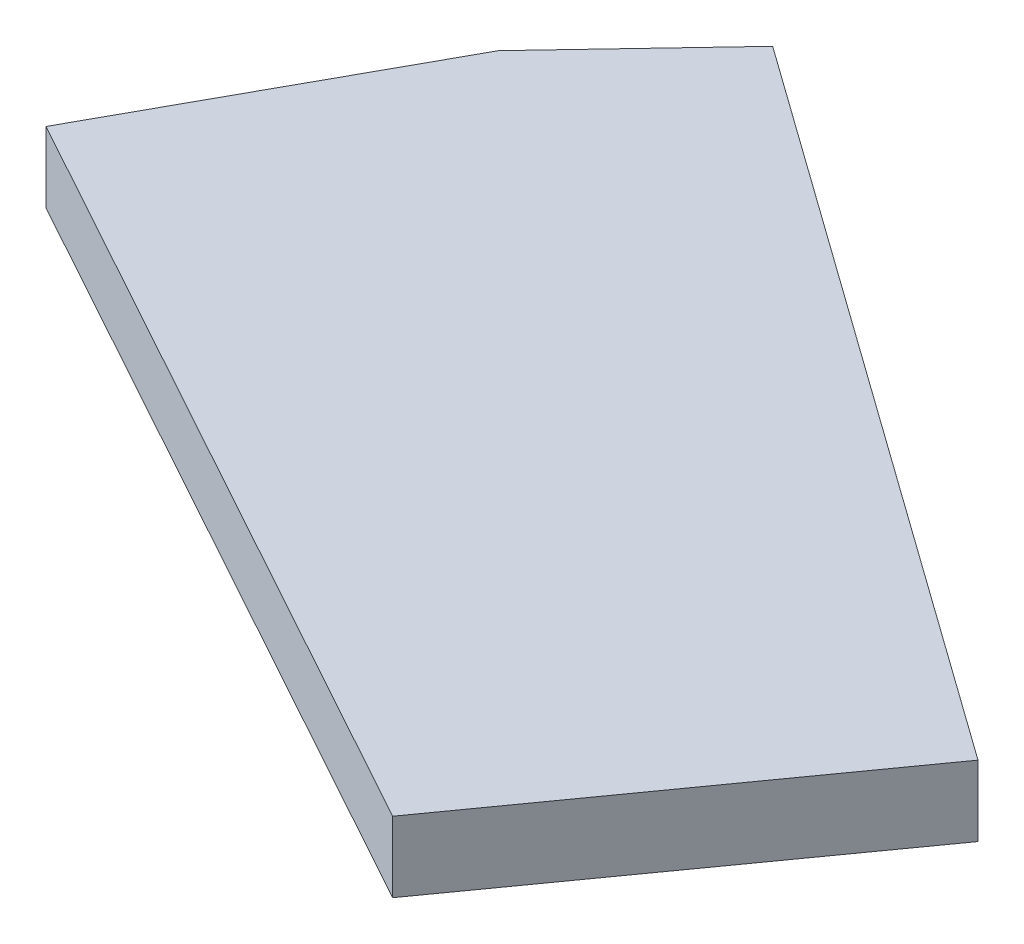
ISO-10303-21;
HEADER;
FILE_DESCRIPTION(('STEP AP214'),'2;1');
FILE_NAME('part.step','',(''),(''),'','','');
FILE_SCHEMA(('AUTOMOTIVE_DESIGN { 1 0 10303 214 1 1 1 1 }'));
ENDSEC;
DATA;
#1=APPLICATION_CONTEXT('core data for automotive mechanical design processes');
#2=APPLICATION_PROTOCOL_DEFINITION('international standard','automotive_design',2000,#1);
#3=PRODUCT_CONTEXT('',#1,'mechanical');
#4=PRODUCT('Part','Part','',(#3));
#5=PRODUCT_RELATED_PRODUCT_CATEGORY('part','',(#4));
#6=PRODUCT_DEFINITION_FORMATION('','',#4);
#7=PRODUCT_DEFINITION_CONTEXT('part definition',#1,'design');
#8=PRODUCT_DEFINITION('design','',#6,#7);
#9=PRODUCT_DEFINITION_SHAPE('','',#8);
#10=(LENGTH_UNIT() NAMED_UNIT(*) SI_UNIT(.MILLI.,.METRE.));
#11=(NAMED_UNIT(*) PLANE_ANGLE_UNIT() SI_UNIT($,.RADIAN.));
#12=(NAMED_UNIT(*) SI_UNIT($,.STERADIAN.) SOLID_ANGLE_UNIT());
#13=UNCERTAINTY_MEASURE_WITH_UNIT(LENGTH_MEASURE(1.E-05),#10,'distance_accuracy_value','');
#14=(GEOMETRIC_REPRESENTATION_CONTEXT(3) GLOBAL_UNCERTAINTY_ASSIGNED_CONTEXT((#13)) GLOBAL_UNIT_ASSIGNED_CONTEXT((#10,
#11,#12)) REPRESENTATION_CONTEXT('',''));
#15=CARTESIAN_POINT('',(0.,0.,0.));
#16=DIRECTION('',(0.,0.,1.));
#17=DIRECTION('',(1.,0.,0.));
#18=AXIS2_PLACEMENT_3D('',#15,#16,#17);
#19=CARTESIAN_POINT('',(-10.6043370878193,7.,-7.95325281586443));
#20=DIRECTION('',(0.,-1.,0.));
#21=DIRECTION('',(0.,0.,-1.));
#22=AXIS2_PLACEMENT_3D('',#19,#20,#21);
#23=CYLINDRICAL_SURFACE('',#22,2.5);
#24=CARTESIAN_POINT('',(-10.6043370878193,7.,-7.95325281586443));
#25=DIRECTION('',(0.,1.,0.));
#26=DIRECTION('',(0.,0.,1.));
#27=AXIS2_PLACEMENT_3D('',#24,#25,#26);
#28=CIRCLE('',#27,2.5);
#29=CARTESIAN_POINT('',(-10.6043370878193,7.,-5.45325281586443));
#30=VERTEX_POINT('',#29);
#31=EDGE_CURVE('E235',#30,#30,#28,.T.);
#32=ORIENTED_EDGE('',*,*,#31,.F.);
#33=EDGE_LOOP('',(#32));
#34=FACE_BOUND('',#33,.T.);
#35=CARTESIAN_POINT('',(-10.6043370878193,4.,-7.95325281586443));
#36=DIRECTION('',(0.,-1.,0.));
#37=DIRECTION('',(0.,0.,-1.));
#38=AXIS2_PLACEMENT_3D('',#35,#36,#37);
#39=CIRCLE('',#38,2.5);
#40=CARTESIAN_POINT('',(-10.6043370878193,4.,-10.4532528158644));
#41=VERTEX_POINT('',#40);
#42=EDGE_CURVE('E452',#41,#41,#39,.T.);
#43=ORIENTED_EDGE('',*,*,#42,.F.);
#44=EDGE_LOOP('',(#43));
#45=FACE_BOUND('',#44,.T.);
#46=ADVANCED_FACE('F49',(#34,#45),#23,.T.);
#47=CARTESIAN_POINT('',(16.0000000000001,7.,12.));
#48=DIRECTION('',(0.,-1.,0.));
#49=DIRECTION('',(0.,0.,-1.));
#50=AXIS2_PLACEMENT_3D('',#47,#48,#49);
#51=CYLINDRICAL_SURFACE('',#50,2.5);
#52=CARTESIAN_POINT('',(16.0000000000001,7.,12.));
#53=DIRECTION('',(0.,1.,0.));
#54=DIRECTION('',(0.,0.,1.));
#55=AXIS2_PLACEMENT_3D('',#52,#53,#54);
#56=CIRCLE('',#55,2.5);
#57=CARTESIAN_POINT('',(16.0000000000001,7.,14.5));
#58=VERTEX_POINT('',#57);
#59=EDGE_CURVE('E312',#58,#58,#56,.T.);
#60=ORIENTED_EDGE('',*,*,#59,.F.);
#61=EDGE_LOOP('',(#60));
#62=FACE_BOUND('',#61,.T.);
#63=CARTESIAN_POINT('',(16.0000000000001,4.,12.));
#64=DIRECTION('',(0.,-1.,0.));
#65=DIRECTION('',(0.,0.,-1.));
#66=AXIS2_PLACEMENT_3D('',#63,#64,#65);
#67=CIRCLE('',#66,2.5);
#68=CARTESIAN_POINT('',(16.0000000000001,4.,9.5));
#69=VERTEX_POINT('',#68);
#70=EDGE_CURVE('E458',#69,#69,#67,.T.);
#71=ORIENTED_EDGE('',*,*,#70,.F.);
#72=EDGE_LOOP('',(#71));
#73=FACE_BOUND('',#72,.T.);
#74=ADVANCED_FACE('F506',(#62,#73),#51,.T.);
#75=CARTESIAN_POINT('',(46.472222222222,7.,-89.1099464803364));
#76=DIRECTION('',(0.,1.,0.));
#77=DIRECTION('',(0.,0.,1.));
#78=AXIS2_PLACEMENT_3D('',#75,#76,#77);
#79=CYLINDRICAL_SURFACE('',#78,90.);
#80=CARTESIAN_POINT('',(46.472222222222,4.,-89.1099464803364));
#81=DIRECTION('',(0.,-1.,0.));
#82=DIRECTION('',(0.,0.,-1.));
#83=AXIS2_PLACEMENT_3D('',#80,#81,#82);
#84=CIRCLE('',#83,90.);
#85=CARTESIAN_POINT('',(4.85530679933662,4.,-9.30999440839336));
#86=VERTEX_POINT('',#85);
#87=CARTESIAN_POINT('',(8.1219684151156,4.,-7.68969081302395));
#88=VERTEX_POINT('',#87);
#89=EDGE_CURVE('E424',#86,#88,#84,.F.);
#90=ORIENTED_EDGE('',*,*,#89,.T.);
#91=DIRECTION('',(0.,-1.,0.));
#92=VECTOR('',#91,1.);
#93=CARTESIAN_POINT('',(8.1219684151156,7.,-7.68969081302395));
#94=LINE('',#93,#92);
#95=CARTESIAN_POINT('',(8.1219684151156,7.,-7.68969081302395));
#96=VERTEX_POINT('',#95);
#97=EDGE_CURVE('E256',#88,#96,#94,.F.);
#98=ORIENTED_EDGE('',*,*,#97,.T.);
#99=CARTESIAN_POINT('',(46.472222222222,7.,-89.1099464803364));
#100=DIRECTION('',(0.,1.,0.));
#101=DIRECTION('',(0.,0.,1.));
#102=AXIS2_PLACEMENT_3D('',#99,#100,#101);
#103=CIRCLE('',#102,90.);
#104=CARTESIAN_POINT('',(4.85530679933662,7.,-9.30999440839336));
#105=VERTEX_POINT('',#104);
#106=EDGE_CURVE('E378',#96,#105,#103,.F.);
#107=ORIENTED_EDGE('',*,*,#106,.T.);
#108=DIRECTION('',(0.,-1.,0.));
#109=VECTOR('',#108,1.);
#110=CARTESIAN_POINT('',(4.85530679933662,7.,-9.30999440839336));
#111=LINE('',#110,#109);
#112=EDGE_CURVE('E250',#105,#86,#111,.T.);
#113=ORIENTED_EDGE('',*,*,#112,.T.);
#114=EDGE_LOOP('',(#90,#98,#107,#113));
#115=FACE_BOUND('',#114,.T.);
#116=ADVANCED_FACE('F508',(#115),#79,.T.);
#117=CARTESIAN_POINT('',(0.,7.,0.));
#118=DIRECTION('',(0.,-1.,0.));
#119=DIRECTION('',(0.,0.,-1.));
#120=AXIS2_PLACEMENT_3D('',#117,#118,#119);
#121=CYLINDRICAL_SURFACE('',#120,10.5);
#122=CARTESIAN_POINT('',(0.,4.,0.));
#123=DIRECTION('',(0.,-1.,0.));
#124=DIRECTION('',(0.,0.,-1.));
#125=AXIS2_PLACEMENT_3D('',#122,#123,#124);
#126=CIRCLE('',#125,10.5);
#127=CARTESIAN_POINT('',(3.10184507129617,4.,-10.0313786267729));
#128=VERTEX_POINT('',#127);
#129=EDGE_CURVE('E420',#128,#86,#126,.T.);
#130=ORIENTED_EDGE('',*,*,#129,.T.);
#131=ORIENTED_EDGE('',*,*,#112,.F.);
#132=CARTESIAN_POINT('',(0.,7.,0.));
#133=DIRECTION('',(0.,1.,0.));
#134=DIRECTION('',(0.,0.,1.));
#135=AXIS2_PLACEMENT_3D('',#132,#133,#134);
#136=CIRCLE('',#135,10.5);
#137=CARTESIAN_POINT('',(3.10184507129617,7.,-10.0313786267729));
#138=VERTEX_POINT('',#137);
#139=EDGE_CURVE('E283',#105,#138,#136,.T.);
#140=ORIENTED_EDGE('',*,*,#139,.T.);
#141=DIRECTION('',(0.,-1.,0.));
#142=VECTOR('',#141,1.);
#143=CARTESIAN_POINT('',(3.10184507129617,7.,-10.0313786267729));
#144=LINE('',#143,#142);
#145=EDGE_CURVE('E230',#138,#128,#144,.T.);
#146=ORIENTED_EDGE('',*,*,#145,.T.);
#147=EDGE_LOOP('',(#130,#131,#140,#146));
#148=FACE_BOUND('',#147,.T.);
#149=ADVANCED_FACE('F515',(#148),#121,.F.);
#150=CARTESIAN_POINT('',(-46.4722222222223,7.,89.1099464803362));
#151=DIRECTION('',(0.,1.,0.));
#152=DIRECTION('',(0.,0.,1.));
#153=AXIS2_PLACEMENT_3D('',#150,#151,#152);
#154=CYLINDRICAL_SURFACE('',#153,90.);
#155=CARTESIAN_POINT('',(-46.4722222222223,4.,89.1099464803362));
#156=DIRECTION('',(0.,-1.,0.));
#157=DIRECTION('',(0.,0.,-1.));
#158=AXIS2_PLACEMENT_3D('',#155,#156,#157);
#159=CIRCLE('',#158,90.);
#160=CARTESIAN_POINT('',(-4.85530679933665,4.,9.30999440839334));
#161=VERTEX_POINT('',#160);
#162=CARTESIAN_POINT('',(-8.12196841511563,4.,7.68969081302394));
#163=VERTEX_POINT('',#162);
#164=EDGE_CURVE('E427',#161,#163,#159,.F.);
#165=ORIENTED_EDGE('',*,*,#164,.T.);
#166=DIRECTION('',(0.,-1.,0.));
#167=VECTOR('',#166,1.);
#168=CARTESIAN_POINT('',(-8.12196841511563,7.,7.68969081302394));
#169=LINE('',#168,#167);
#170=CARTESIAN_POINT('',(-8.12196841511563,7.,7.68969081302394));
#171=VERTEX_POINT('',#170);
#172=EDGE_CURVE('E381',#163,#171,#169,.F.);
#173=ORIENTED_EDGE('',*,*,#172,.T.);
#174=CARTESIAN_POINT('',(-46.4722222222223,7.,89.1099464803362));
#175=DIRECTION('',(0.,1.,0.));
#176=DIRECTION('',(0.,0.,1.));
#177=AXIS2_PLACEMENT_3D('',#174,#175,#176);
#178=CIRCLE('',#177,90.);
#179=CARTESIAN_POINT('',(-4.85530679933665,7.,9.30999440839334));
#180=VERTEX_POINT('',#179);
#181=EDGE_CURVE('E374',#171,#180,#178,.F.);
#182=ORIENTED_EDGE('',*,*,#181,.T.);
#183=DIRECTION('',(0.,-1.,0.));
#184=VECTOR('',#183,1.);
#185=CARTESIAN_POINT('',(-4.85530679933665,7.,9.30999440839334));
#186=LINE('',#185,#184);
#187=EDGE_CURVE('E382',#180,#161,#186,.T.);
#188=ORIENTED_EDGE('',*,*,#187,.T.);
#189=EDGE_LOOP('',(#165,#173,#182,#188));
#190=FACE_BOUND('',#189,.T.);
#191=ADVANCED_FACE('F554',(#190),#154,.T.);
#192=CARTESIAN_POINT('',(0.,7.,0.));
#193=DIRECTION('',(0.,-1.,0.));
#194=DIRECTION('',(0.,0.,-1.));
#195=AXIS2_PLACEMENT_3D('',#192,#193,#194);
#196=CYLINDRICAL_SURFACE('',#195,10.5);
#197=CARTESIAN_POINT('',(0.,4.,0.));
#198=DIRECTION('',(0.,-1.,0.));
#199=DIRECTION('',(0.,0.,-1.));
#200=AXIS2_PLACEMENT_3D('',#197,#198,#199);
#201=CIRCLE('',#200,10.5);
#202=CARTESIAN_POINT('',(-4.24846021002008,4.,9.60211361336014));
#203=VERTEX_POINT('',#202);
#204=EDGE_CURVE('E403',#203,#161,#201,.T.);
#205=ORIENTED_EDGE('',*,*,#204,.T.);
#206=ORIENTED_EDGE('',*,*,#187,.F.);
#207=CARTESIAN_POINT('',(0.,7.,0.));
#208=DIRECTION('',(0.,1.,0.));
#209=DIRECTION('',(0.,0.,1.));
#210=AXIS2_PLACEMENT_3D('',#207,#208,#209);
#211=CIRCLE('',#210,10.5);
#212=CARTESIAN_POINT('',(-4.24846021002008,7.,9.60211361336014));
#213=VERTEX_POINT('',#212);
#214=EDGE_CURVE('E301',#180,#213,#211,.T.);
#215=ORIENTED_EDGE('',*,*,#214,.T.);
#216=DIRECTION('',(0.,-1.,0.));
#217=VECTOR('',#216,1.);
#218=CARTESIAN_POINT('',(-4.24846021002008,7.,9.60211361336014));
#219=LINE('',#218,#217);
#220=EDGE_CURVE('E265',#213,#203,#219,.T.);
#221=ORIENTED_EDGE('',*,*,#220,.T.);
#222=EDGE_LOOP('',(#205,#206,#215,#221));
#223=FACE_BOUND('',#222,.T.);
#224=ADVANCED_FACE('F550',(#223),#196,.F.);
#225=CARTESIAN_POINT('',(-6.02777777777778,7.,7.34274438215906));
#226=DIRECTION('',(0.,-1.,0.));
#227=DIRECTION('',(0.,0.,-1.));
#228=AXIS2_PLACEMENT_3D('',#225,#226,#227);
#229=CYLINDRICAL_SURFACE('',#228,3.);
#230=DIRECTION('',(0.,-1.,0.));
#231=VECTOR('',#230,1.);
#232=CARTESIAN_POINT('',(-4.12426900584795,7.,5.02398299831935));
#233=LINE('',#232,#231);
#234=CARTESIAN_POINT('',(-4.12426900584795,4.,5.02398299831935));
#235=VERTEX_POINT('',#234);
#236=CARTESIAN_POINT('',(-4.12426900584795,7.,5.02398299831935));
#237=VERTEX_POINT('',#236);
#238=EDGE_CURVE('E356',#235,#237,#233,.F.);
#239=ORIENTED_EDGE('',*,*,#238,.T.);
#240=CARTESIAN_POINT('',(-6.02777777777778,7.,7.34274438215906));
#241=DIRECTION('',(0.,1.,0.));
#242=DIRECTION('',(0.,0.,1.));
#243=AXIS2_PLACEMENT_3D('',#240,#241,#242);
#244=CIRCLE('',#243,3.);
#245=CARTESIAN_POINT('',(-5.41666666666667,7.,4.40564662929543));
#246=VERTEX_POINT('',#245);
#247=EDGE_CURVE('E434',#237,#246,#244,.T.);
#248=ORIENTED_EDGE('',*,*,#247,.T.);
#249=DIRECTION('',(0.,-1.,0.));
#250=VECTOR('',#249,1.);
#251=CARTESIAN_POINT('',(-5.41666666666667,7.,4.40564662929543));
#252=LINE('',#251,#250);
#253=CARTESIAN_POINT('',(-5.41666666666667,4.,4.40564662929543));
#254=VERTEX_POINT('',#253);
#255=EDGE_CURVE('E370',#246,#254,#252,.T.);
#256=ORIENTED_EDGE('',*,*,#255,.T.);
#257=CARTESIAN_POINT('',(-6.02777777777778,4.,7.34274438215906));
#258=DIRECTION('',(0.,-1.,0.));
#259=DIRECTION('',(0.,0.,-1.));
#260=AXIS2_PLACEMENT_3D('',#257,#258,#259);
#261=CIRCLE('',#260,3.);
#262=EDGE_CURVE('E498',#235,#254,#261,.F.);
#263=ORIENTED_EDGE('',*,*,#262,.F.);
#264=EDGE_LOOP('',(#239,#248,#256,#263));
#265=FACE_BOUND('',#264,.T.);
#266=ADVANCED_FACE('F553',(#265),#229,.F.);
#267=CARTESIAN_POINT('',(6.02777777777778,7.,7.34274438215906));
#268=DIRECTION('',(0.,-1.,0.));
#269=DIRECTION('',(0.,0.,-1.));
#270=AXIS2_PLACEMENT_3D('',#267,#268,#269);
#271=CYLINDRICAL_SURFACE('',#270,3.);
#272=DIRECTION('',(0.,-1.,0.));
#273=VECTOR('',#272,1.);
#274=CARTESIAN_POINT('',(5.41666666666667,7.,4.40564662929543));
#275=LINE('',#274,#273);
#276=CARTESIAN_POINT('',(5.41666666666667,4.,4.40564662929543));
#277=VERTEX_POINT('',#276);
#278=CARTESIAN_POINT('',(5.41666666666667,7.,4.40564662929543));
#279=VERTEX_POINT('',#278);
#280=EDGE_CURVE('E350',#277,#279,#275,.F.);
#281=ORIENTED_EDGE('',*,*,#280,.T.);
#282=CARTESIAN_POINT('',(6.02777777777778,7.,7.34274438215906));
#283=DIRECTION('',(0.,1.,0.));
#284=DIRECTION('',(0.,0.,1.));
#285=AXIS2_PLACEMENT_3D('',#282,#283,#284);
#286=CIRCLE('',#285,3.);
#287=CARTESIAN_POINT('',(4.12426900584795,7.,5.02398299831935));
#288=VERTEX_POINT('',#287);
#289=EDGE_CURVE('E360',#279,#288,#286,.T.);
#290=ORIENTED_EDGE('',*,*,#289,.T.);
#291=DIRECTION('',(0.,-1.,0.));
#292=VECTOR('',#291,1.);
#293=CARTESIAN_POINT('',(4.12426900584795,7.,5.02398299831935));
#294=LINE('',#293,#292);
#295=CARTESIAN_POINT('',(4.12426900584795,4.,5.02398299831935));
#296=VERTEX_POINT('',#295);
#297=EDGE_CURVE('E363',#288,#296,#294,.T.);
#298=ORIENTED_EDGE('',*,*,#297,.T.);
#299=CARTESIAN_POINT('',(6.02777777777778,4.,7.34274438215906));
#300=DIRECTION('',(0.,-1.,0.));
#301=DIRECTION('',(0.,0.,-1.));
#302=AXIS2_PLACEMENT_3D('',#299,#300,#301);
#303=CIRCLE('',#302,3.);
#304=EDGE_CURVE('E486',#277,#296,#303,.F.);
#305=ORIENTED_EDGE('',*,*,#304,.F.);
#306=EDGE_LOOP('',(#281,#290,#298,#305));
#307=FACE_BOUND('',#306,.T.);
#308=ADVANCED_FACE('F440',(#307),#271,.F.);
#309=CARTESIAN_POINT('',(6.02777777777778,7.,-7.34274438215906));
#310=DIRECTION('',(0.,-1.,0.));
#311=DIRECTION('',(0.,0.,-1.));
#312=AXIS2_PLACEMENT_3D('',#309,#310,#311);
#313=CYLINDRICAL_SURFACE('',#312,3.);
#314=DIRECTION('',(0.,-1.,0.));
#315=VECTOR('',#314,1.);
#316=CARTESIAN_POINT('',(4.12426900584795,7.,-5.02398299831935));
#317=LINE('',#316,#315);
#318=CARTESIAN_POINT('',(4.12426900584795,4.,-5.02398299831935));
#319=VERTEX_POINT('',#318);
#320=CARTESIAN_POINT('',(4.12426900584795,7.,-5.02398299831935));
#321=VERTEX_POINT('',#320);
#322=EDGE_CURVE('E343',#319,#321,#317,.F.);
#323=ORIENTED_EDGE('',*,*,#322,.T.);
#324=CARTESIAN_POINT('',(6.02777777777778,7.,-7.34274438215906));
#325=DIRECTION('',(0.,1.,0.));
#326=DIRECTION('',(0.,0.,1.));
#327=AXIS2_PLACEMENT_3D('',#324,#325,#326);
#328=CIRCLE('',#327,3.);
#329=CARTESIAN_POINT('',(5.41666666666667,7.,-4.40564662929543));
#330=VERTEX_POINT('',#329);
#331=EDGE_CURVE('E338',#321,#330,#328,.T.);
#332=ORIENTED_EDGE('',*,*,#331,.T.);
#333=DIRECTION('',(0.,-1.,0.));
#334=VECTOR('',#333,1.);
#335=CARTESIAN_POINT('',(5.41666666666667,7.,-4.40564662929543));
#336=LINE('',#335,#334);
#337=CARTESIAN_POINT('',(5.41666666666667,4.,-4.40564662929543));
#338=VERTEX_POINT('',#337);
#339=EDGE_CURVE('E430',#330,#338,#336,.T.);
#340=ORIENTED_EDGE('',*,*,#339,.T.);
#341=CARTESIAN_POINT('',(6.02777777777778,4.,-7.34274438215906));
#342=DIRECTION('',(0.,-1.,0.));
#343=DIRECTION('',(0.,0.,-1.));
#344=AXIS2_PLACEMENT_3D('',#341,#342,#343);
#345=CIRCLE('',#344,3.);
#346=EDGE_CURVE('E482',#319,#338,#345,.F.);
#347=ORIENTED_EDGE('',*,*,#346,.F.);
#348=EDGE_LOOP('',(#323,#332,#340,#347));
#349=FACE_BOUND('',#348,.T.);
#350=ADVANCED_FACE('F481',(#349),#313,.F.);
#351=CARTESIAN_POINT('',(-6.02777777777778,7.,-7.34274438215906));
#352=DIRECTION('',(0.,-1.,0.));
#353=DIRECTION('',(0.,0.,-1.));
#354=AXIS2_PLACEMENT_3D('',#351,#352,#353);
#355=CYLINDRICAL_SURFACE('',#354,3.);
#356=DIRECTION('',(0.,-1.,0.));
#357=VECTOR('',#356,1.);
#358=CARTESIAN_POINT('',(-5.41666666666667,7.,-4.40564662929543));
#359=LINE('',#358,#357);
#360=CARTESIAN_POINT('',(-5.41666666666667,4.,-4.40564662929543));
#361=VERTEX_POINT('',#360);
#362=CARTESIAN_POINT('',(-5.41666666666667,7.,-4.40564662929543));
#363=VERTEX_POINT('',#362);
#364=EDGE_CURVE('E354',#361,#363,#359,.F.);
#365=ORIENTED_EDGE('',*,*,#364,.T.);
#366=CARTESIAN_POINT('',(-6.02777777777778,7.,-7.34274438215906));
#367=DIRECTION('',(0.,1.,0.));
#368=DIRECTION('',(0.,0.,1.));
#369=AXIS2_PLACEMENT_3D('',#366,#367,#368);
#370=CIRCLE('',#369,3.);
#371=CARTESIAN_POINT('',(-4.12426900584795,7.,-5.02398299831935));
#372=VERTEX_POINT('',#371);
#373=EDGE_CURVE('E337',#363,#372,#370,.T.);
#374=ORIENTED_EDGE('',*,*,#373,.T.);
#375=DIRECTION('',(0.,-1.,0.));
#376=VECTOR('',#375,1.);
#377=CARTESIAN_POINT('',(-4.12426900584795,7.,-5.02398299831935));
#378=LINE('',#377,#376);
#379=CARTESIAN_POINT('',(-4.12426900584795,4.,-5.02398299831935));
#380=VERTEX_POINT('',#379);
#381=EDGE_CURVE('E345',#372,#380,#378,.T.);
#382=ORIENTED_EDGE('',*,*,#381,.T.);
#383=CARTESIAN_POINT('',(-6.02777777777778,4.,-7.34274438215906));
#384=DIRECTION('',(0.,-1.,0.));
#385=DIRECTION('',(0.,0.,-1.));
#386=AXIS2_PLACEMENT_3D('',#383,#384,#385);
#387=CIRCLE('',#386,3.);
#388=EDGE_CURVE('E485',#361,#380,#387,.F.);
#389=ORIENTED_EDGE('',*,*,#388,.F.);
#390=EDGE_LOOP('',(#365,#374,#382,#389));
#391=FACE_BOUND('',#390,.T.);
#392=ADVANCED_FACE('F352',(#391),#355,.F.);
#393=CARTESIAN_POINT('',(-4.5,7.,0.));
#394=DIRECTION('',(0.,-1.,0.));
#395=DIRECTION('',(0.,0.,-1.));
#396=AXIS2_PLACEMENT_3D('',#393,#394,#395);
#397=CYLINDRICAL_SURFACE('',#396,4.5);
#398=CARTESIAN_POINT('',(-4.5,4.,0.));
#399=DIRECTION('',(0.,-1.,0.));
#400=DIRECTION('',(0.,0.,-1.));
#401=AXIS2_PLACEMENT_3D('',#398,#399,#400);
#402=CIRCLE('',#401,4.5);
#403=EDGE_CURVE('E416',#361,#254,#402,.F.);
#404=ORIENTED_EDGE('',*,*,#403,.T.);
#405=ORIENTED_EDGE('',*,*,#255,.F.);
#406=CARTESIAN_POINT('',(-4.5,7.,0.));
#407=DIRECTION('',(0.,1.,0.));
#408=DIRECTION('',(0.,0.,1.));
#409=AXIS2_PLACEMENT_3D('',#406,#407,#408);
#410=CIRCLE('',#409,4.5);
#411=EDGE_CURVE('E316',#246,#363,#410,.F.);
#412=ORIENTED_EDGE('',*,*,#411,.T.);
#413=ORIENTED_EDGE('',*,*,#364,.F.);
#414=EDGE_LOOP('',(#404,#405,#412,#413));
#415=FACE_BOUND('',#414,.T.);
#416=ADVANCED_FACE('F521',(#415),#397,.T.);
#417=CARTESIAN_POINT('',(0.,7.,0.));
#418=DIRECTION('',(0.,-1.,0.));
#419=DIRECTION('',(0.,0.,-1.));
#420=AXIS2_PLACEMENT_3D('',#417,#418,#419);
#421=CYLINDRICAL_SURFACE('',#420,6.5);
#422=ORIENTED_EDGE('',*,*,#381,.F.);
#423=CARTESIAN_POINT('',(0.,7.,0.));
#424=DIRECTION('',(0.,1.,0.));
#425=DIRECTION('',(0.,0.,1.));
#426=AXIS2_PLACEMENT_3D('',#423,#424,#425);
#427=CIRCLE('',#426,6.5);
#428=EDGE_CURVE('E53',#321,#372,#427,.T.);
#429=ORIENTED_EDGE('',*,*,#428,.F.);
#430=ORIENTED_EDGE('',*,*,#322,.F.);
#431=CARTESIAN_POINT('',(0.,4.,0.));
#432=DIRECTION('',(0.,-1.,0.));
#433=DIRECTION('',(0.,0.,-1.));
#434=AXIS2_PLACEMENT_3D('',#431,#432,#433);
#435=CIRCLE('',#434,6.5);
#436=EDGE_CURVE('E347',#380,#319,#435,.T.);
#437=ORIENTED_EDGE('',*,*,#436,.F.);
#438=EDGE_LOOP('',(#422,#429,#430,#437));
#439=FACE_BOUND('',#438,.T.);
#440=ADVANCED_FACE('F341',(#439),#421,.T.);
#441=CARTESIAN_POINT('',(0.,7.,0.));
#442=DIRECTION('',(0.,1.,0.));
#443=DIRECTION('',(0.,0.,1.));
#444=AXIS2_PLACEMENT_3D('',#441,#442,#443);
#445=PLANE('',#444);
#446=CARTESIAN_POINT('',(0.,7.,0.));
#447=DIRECTION('',(0.,1.,0.));
#448=DIRECTION('',(0.,0.,1.));
#449=AXIS2_PLACEMENT_3D('',#446,#447,#448);
#450=CIRCLE('',#449,6.5);
#451=EDGE_CURVE('E320',#237,#288,#450,.T.);
#452=ORIENTED_EDGE('',*,*,#451,.T.);
#453=ORIENTED_EDGE('',*,*,#289,.F.);
#454=CARTESIAN_POINT('',(4.5,7.,0.));
#455=DIRECTION('',(0.,1.,0.));
#456=DIRECTION('',(0.,0.,1.));
#457=AXIS2_PLACEMENT_3D('',#454,#455,#456);
#458=CIRCLE('',#457,4.5);
#459=EDGE_CURVE('E323',#279,#330,#458,.T.);
#460=ORIENTED_EDGE('',*,*,#459,.T.);
#461=ORIENTED_EDGE('',*,*,#331,.F.);
#462=ORIENTED_EDGE('',*,*,#428,.T.);
#463=ORIENTED_EDGE('',*,*,#373,.F.);
#464=ORIENTED_EDGE('',*,*,#411,.F.);
#465=ORIENTED_EDGE('',*,*,#247,.F.);
#466=EDGE_LOOP('',(#452,#453,#460,#461,#462,#463,#464,#465));
#467=FACE_BOUND('',#466,.T.);
#468=ORIENTED_EDGE('',*,*,#59,.T.);
#469=EDGE_LOOP('',(#468));
#470=FACE_BOUND('',#469,.T.);
#471=ORIENTED_EDGE('',*,*,#31,.T.);
#472=EDGE_LOOP('',(#471));
#473=FACE_BOUND('',#472,.T.);
#474=DIRECTION('',(0.955369393025988,0.,0.295413816313921));
#475=VECTOR('',#474,1.);
#476=CARTESIAN_POINT('',(3.10184507129617,7.,-10.0313786267729));
#477=LINE('',#476,#475);
#478=CARTESIAN_POINT('',(-8.82169982054453,7.,-13.7183084428228));
#479=VERTEX_POINT('',#478);
#480=EDGE_CURVE('E223',#479,#138,#477,.T.);
#481=ORIENTED_EDGE('',*,*,#480,.T.);
#482=ORIENTED_EDGE('',*,*,#139,.F.);
#483=ORIENTED_EDGE('',*,*,#106,.F.);
#484=CARTESIAN_POINT('',(4.5,7.,0.));
#485=DIRECTION('',(0.,1.,0.));
#486=DIRECTION('',(0.,0.,1.));
#487=AXIS2_PLACEMENT_3D('',#484,#485,#486);
#488=CIRCLE('',#487,8.5);
#489=CARTESIAN_POINT('',(11.4516960215957,7.,-4.89120868736258));
#490=VERTEX_POINT('',#489);
#491=EDGE_CURVE('E286',#490,#96,#488,.T.);
#492=ORIENTED_EDGE('',*,*,#491,.F.);
#493=DIRECTION('',(0.575436316160303,0.,0.81784659077596));
#494=VECTOR('',#493,1.);
#495=CARTESIAN_POINT('',(9.96162472879303,7.,-7.00899251957429));
#496=LINE('',#495,#494);
#497=CARTESIAN_POINT('',(20.9070795446559,7.,8.54738210303818));
#498=VERTEX_POINT('',#497);
#499=EDGE_CURVE('E290',#490,#498,#496,.T.);
#500=ORIENTED_EDGE('',*,*,#499,.T.);
#501=CARTESIAN_POINT('',(16.0000000000001,7.,12.));
#502=DIRECTION('',(0.,1.,0.));
#503=DIRECTION('',(0.,0.,1.));
#504=AXIS2_PLACEMENT_3D('',#501,#502,#503);
#505=CIRCLE('',#504,6.);
#506=CARTESIAN_POINT('',(13.5723084514172,7.,17.4869220647772));
#507=VERTEX_POINT('',#506);
#508=EDGE_CURVE('E293',#507,#498,#505,.T.);
#509=ORIENTED_EDGE('',*,*,#508,.F.);
#510=DIRECTION('',(0.914487010796204,0.,0.40461525809715));
#511=VECTOR('',#510,1.);
#512=CARTESIAN_POINT('',(-4.24846021002008,7.,9.60211361336014));
#513=LINE('',#512,#511);
#514=EDGE_CURVE('E297',#213,#507,#513,.T.);
#515=ORIENTED_EDGE('',*,*,#514,.F.);
#516=ORIENTED_EDGE('',*,*,#214,.F.);
#517=ORIENTED_EDGE('',*,*,#181,.F.);
#518=CARTESIAN_POINT('',(-4.5,7.,0.));
#519=DIRECTION('',(0.,1.,0.));
#520=DIRECTION('',(0.,0.,1.));
#521=AXIS2_PLACEMENT_3D('',#518,#519,#520);
#522=CIRCLE('',#521,8.5);
#523=CARTESIAN_POINT('',(-12.3085207840849,7.,3.35812494772206));
#524=VERTEX_POINT('',#523);
#525=EDGE_CURVE('E304',#171,#524,#522,.F.);
#526=ORIENTED_EDGE('',*,*,#525,.T.);
#527=DIRECTION('',(0.39507352326142,0.,0.918649504009994));
#528=VECTOR('',#527,1.);
#529=CARTESIAN_POINT('',(-11.6061468845651,7.,4.99132838058419));
#530=LINE('',#529,#528);
#531=CARTESIAN_POINT('',(-16.1478111942284,7.,-5.56923166659305));
#532=VERTEX_POINT('',#531);
#533=EDGE_CURVE('E240',#532,#524,#530,.T.);
#534=ORIENTED_EDGE('',*,*,#533,.F.);
#535=CARTESIAN_POINT('',(-10.6043370878193,7.,-7.95325281586443));
#536=DIRECTION('',(0.,1.,0.));
#537=DIRECTION('',(0.,0.,1.));
#538=AXIS2_PLACEMENT_3D('',#535,#536,#537);
#539=CIRCLE('',#538,6.03437337331733);
#540=EDGE_CURVE('E234',#479,#532,#539,.T.);
#541=ORIENTED_EDGE('',*,*,#540,.F.);
#542=EDGE_LOOP('',(#481,#482,#483,#492,#500,#509,#515,#516,#517,#526,#534,#541));
#543=FACE_BOUND('',#542,.T.);
#544=ADVANCED_FACE('F238',(#467,#470,#473,#543),#445,.F.);
#545=CARTESIAN_POINT('',(4.5,7.,0.));
#546=DIRECTION('',(0.,-1.,0.));
#547=DIRECTION('',(0.,0.,-1.));
#548=AXIS2_PLACEMENT_3D('',#545,#546,#547);
#549=CYLINDRICAL_SURFACE('',#548,4.5);
#550=ORIENTED_EDGE('',*,*,#339,.F.);
#551=ORIENTED_EDGE('',*,*,#459,.F.);
#552=ORIENTED_EDGE('',*,*,#280,.F.);
#553=CARTESIAN_POINT('',(4.5,4.,0.));
#554=DIRECTION('',(0.,-1.,0.));
#555=DIRECTION('',(0.,0.,-1.));
#556=AXIS2_PLACEMENT_3D('',#553,#554,#555);
#557=CIRCLE('',#556,4.5);
#558=EDGE_CURVE('E453',#338,#277,#557,.T.);
#559=ORIENTED_EDGE('',*,*,#558,.F.);
#560=EDGE_LOOP('',(#550,#551,#552,#559));
#561=FACE_BOUND('',#560,.T.);
#562=ADVANCED_FACE('F527',(#561),#549,.T.);
#563=CARTESIAN_POINT('',(0.,7.,0.));
#564=DIRECTION('',(0.,-1.,0.));
#565=DIRECTION('',(0.,0.,-1.));
#566=AXIS2_PLACEMENT_3D('',#563,#564,#565);
#567=CYLINDRICAL_SURFACE('',#566,6.5);
#568=ORIENTED_EDGE('',*,*,#297,.F.);
#569=ORIENTED_EDGE('',*,*,#451,.F.);
#570=ORIENTED_EDGE('',*,*,#238,.F.);
#571=CARTESIAN_POINT('',(0.,4.,0.));
#572=DIRECTION('',(0.,-1.,0.));
#573=DIRECTION('',(0.,0.,-1.));
#574=AXIS2_PLACEMENT_3D('',#571,#572,#573);
#575=CIRCLE('',#574,6.5);
#576=EDGE_CURVE('E449',#296,#235,#575,.T.);
#577=ORIENTED_EDGE('',*,*,#576,.F.);
#578=EDGE_LOOP('',(#568,#569,#570,#577));
#579=FACE_BOUND('',#578,.T.);
#580=ADVANCED_FACE('F447',(#579),#567,.T.);
#581=CARTESIAN_POINT('',(-4.5,7.,0.));
#582=DIRECTION('',(0.,-1.,0.));
#583=DIRECTION('',(0.,0.,-1.));
#584=AXIS2_PLACEMENT_3D('',#581,#582,#583);
#585=CYLINDRICAL_SURFACE('',#584,8.5);
#586=DIRECTION('',(0.,-1.,0.));
#587=VECTOR('',#586,1.);
#588=CARTESIAN_POINT('',(-12.3085207840849,7.,3.35812494772206));
#589=LINE('',#588,#587);
#590=CARTESIAN_POINT('',(-12.3085207840849,4.,3.35812494772206));
#591=VERTEX_POINT('',#590);
#592=EDGE_CURVE('E258',#524,#591,#589,.T.);
#593=ORIENTED_EDGE('',*,*,#592,.F.);
#594=ORIENTED_EDGE('',*,*,#525,.F.);
#595=ORIENTED_EDGE('',*,*,#172,.F.);
#596=CARTESIAN_POINT('',(-4.5,4.,0.));
#597=DIRECTION('',(0.,-1.,0.));
#598=DIRECTION('',(0.,0.,-1.));
#599=AXIS2_PLACEMENT_3D('',#596,#597,#598);
#600=CIRCLE('',#599,8.5);
#601=EDGE_CURVE('E470',#591,#163,#600,.F.);
#602=ORIENTED_EDGE('',*,*,#601,.F.);
#603=EDGE_LOOP('',(#593,#594,#595,#602));
#604=FACE_BOUND('',#603,.T.);
#605=ADVANCED_FACE('F526',(#604),#585,.F.);
#606=CARTESIAN_POINT('',(4.5,7.,0.));
#607=DIRECTION('',(0.,-1.,0.));
#608=DIRECTION('',(0.,0.,-1.));
#609=AXIS2_PLACEMENT_3D('',#606,#607,#608);
#610=CYLINDRICAL_SURFACE('',#609,8.5);
#611=CARTESIAN_POINT('',(4.5,4.,0.));
#612=DIRECTION('',(0.,-1.,0.));
#613=DIRECTION('',(0.,0.,-1.));
#614=AXIS2_PLACEMENT_3D('',#611,#612,#613);
#615=CIRCLE('',#614,8.5);
#616=CARTESIAN_POINT('',(11.4516960215957,4.,-4.89120868736258));
#617=VERTEX_POINT('',#616);
#618=EDGE_CURVE('E413',#88,#617,#615,.T.);
#619=ORIENTED_EDGE('',*,*,#618,.T.);
#620=DIRECTION('',(0.,-1.,0.));
#621=VECTOR('',#620,1.);
#622=CARTESIAN_POINT('',(11.4516960215957,7.,-4.89120868736258));
#623=LINE('',#622,#621);
#624=EDGE_CURVE('E277',#490,#617,#623,.T.);
#625=ORIENTED_EDGE('',*,*,#624,.F.);
#626=ORIENTED_EDGE('',*,*,#491,.T.);
#627=ORIENTED_EDGE('',*,*,#97,.F.);
#628=EDGE_LOOP('',(#619,#625,#626,#627));
#629=FACE_BOUND('',#628,.T.);
#630=ADVANCED_FACE('F533',(#629),#610,.F.);
#631=CARTESIAN_POINT('',(3.10184507129617,7.,-10.0313786267729));
#632=DIRECTION('',(0.295413816313921,0.,-0.955369393025988));
#633=DIRECTION('',(-0.955369393025988,0.,-0.295413816313921));
#634=AXIS2_PLACEMENT_3D('',#631,#632,#633);
#635=PLANE('',#634);
#636=ORIENTED_EDGE('',*,*,#145,.F.);
#637=ORIENTED_EDGE('',*,*,#480,.F.);
#638=DIRECTION('',(0.,-1.,0.));
#639=VECTOR('',#638,1.);
#640=CARTESIAN_POINT('',(-8.82169982054453,7.,-13.7183084428228));
#641=LINE('',#640,#639);
#642=CARTESIAN_POINT('',(-8.82169982054453,4.,-13.7183084428228));
#643=VERTEX_POINT('',#642);
#644=EDGE_CURVE('E227',#479,#643,#641,.T.);
#645=ORIENTED_EDGE('',*,*,#644,.T.);
#646=DIRECTION('',(-0.955369393025988,0.,-0.295413816313921));
#647=VECTOR('',#646,1.);
#648=CARTESIAN_POINT('',(3.10184507129617,4.,-10.0313786267729));
#649=LINE('',#648,#647);
#650=EDGE_CURVE('E399',#128,#643,#649,.T.);
#651=ORIENTED_EDGE('',*,*,#650,.F.);
#652=EDGE_LOOP('',(#636,#637,#645,#651));
#653=FACE_BOUND('',#652,.T.);
#654=ADVANCED_FACE('F51',(#653),#635,.F.);
#655=CARTESIAN_POINT('',(9.96162472879303,7.,-7.00899251957429));
#656=DIRECTION('',(0.81784659077596,0.,-0.575436316160303));
#657=DIRECTION('',(-0.575436316160303,0.,-0.81784659077596));
#658=AXIS2_PLACEMENT_3D('',#655,#656,#657);
#659=PLANE('',#658);
#660=DIRECTION('',(0.,-1.,0.));
#661=VECTOR('',#660,1.);
#662=CARTESIAN_POINT('',(20.9070795446559,7.,8.54738210303818));
#663=LINE('',#662,#661);
#664=CARTESIAN_POINT('',(20.9070795446559,4.,8.54738210303818));
#665=VERTEX_POINT('',#664);
#666=EDGE_CURVE('E273',#498,#665,#663,.T.);
#667=ORIENTED_EDGE('',*,*,#666,.F.);
#668=ORIENTED_EDGE('',*,*,#499,.F.);
#669=ORIENTED_EDGE('',*,*,#624,.T.);
#670=DIRECTION('',(-0.575436316160303,0.,-0.81784659077596));
#671=VECTOR('',#670,1.);
#672=CARTESIAN_POINT('',(9.96162472879303,4.,-7.00899251957429));
#673=LINE('',#672,#671);
#674=EDGE_CURVE('E466',#665,#617,#673,.T.);
#675=ORIENTED_EDGE('',*,*,#674,.F.);
#676=EDGE_LOOP('',(#667,#668,#669,#675));
#677=FACE_BOUND('',#676,.T.);
#678=ADVANCED_FACE('F537',(#677),#659,.F.);
#679=CARTESIAN_POINT('',(16.0000000000001,7.,12.));
#680=DIRECTION('',(0.,-1.,0.));
#681=DIRECTION('',(0.,0.,-1.));
#682=AXIS2_PLACEMENT_3D('',#679,#680,#681);
#683=CYLINDRICAL_SURFACE('',#682,6.);
#684=CARTESIAN_POINT('',(16.0000000000001,4.,12.));
#685=DIRECTION('',(0.,-1.,0.));
#686=DIRECTION('',(0.,0.,-1.));
#687=AXIS2_PLACEMENT_3D('',#684,#685,#686);
#688=CIRCLE('',#687,6.);
#689=CARTESIAN_POINT('',(13.5723084514172,4.,17.4869220647772));
#690=VERTEX_POINT('',#689);
#691=EDGE_CURVE('E410',#665,#690,#688,.T.);
#692=ORIENTED_EDGE('',*,*,#691,.T.);
#693=DIRECTION('',(0.,-1.,0.));
#694=VECTOR('',#693,1.);
#695=CARTESIAN_POINT('',(13.5723084514172,7.,17.4869220647772));
#696=LINE('',#695,#694);
#697=EDGE_CURVE('E269',#507,#690,#696,.T.);
#698=ORIENTED_EDGE('',*,*,#697,.F.);
#699=ORIENTED_EDGE('',*,*,#508,.T.);
#700=ORIENTED_EDGE('',*,*,#666,.T.);
#701=EDGE_LOOP('',(#692,#698,#699,#700));
#702=FACE_BOUND('',#701,.T.);
#703=ADVANCED_FACE('F540',(#702),#683,.F.);
#704=CARTESIAN_POINT('',(-4.24846021002008,7.,9.60211361336014));
#705=DIRECTION('',(0.40461525809715,0.,-0.914487010796204));
#706=DIRECTION('',(-0.914487010796204,0.,-0.40461525809715));
#707=AXIS2_PLACEMENT_3D('',#704,#705,#706);
#708=PLANE('',#707);
#709=DIRECTION('',(-0.914487010796204,0.,-0.40461525809715));
#710=VECTOR('',#709,1.);
#711=CARTESIAN_POINT('',(-4.24846021002008,4.,9.60211361336014));
#712=LINE('',#711,#710);
#713=EDGE_CURVE('E406',#690,#203,#712,.T.);
#714=ORIENTED_EDGE('',*,*,#713,.T.);
#715=ORIENTED_EDGE('',*,*,#220,.F.);
#716=ORIENTED_EDGE('',*,*,#514,.T.);
#717=ORIENTED_EDGE('',*,*,#697,.T.);
#718=EDGE_LOOP('',(#714,#715,#716,#717));
#719=FACE_BOUND('',#718,.T.);
#720=ADVANCED_FACE('F544',(#719),#708,.T.);
#721=CARTESIAN_POINT('',(-11.6061468845651,7.,4.99132838058419));
#722=DIRECTION('',(0.918649504009994,0.,-0.39507352326142));
#723=DIRECTION('',(-0.39507352326142,0.,-0.918649504009994));
#724=AXIS2_PLACEMENT_3D('',#721,#722,#723);
#725=PLANE('',#724);
#726=DIRECTION('',(-0.39507352326142,0.,-0.918649504009994));
#727=VECTOR('',#726,1.);
#728=CARTESIAN_POINT('',(-11.6061468845651,4.,4.99132838058419));
#729=LINE('',#728,#727);
#730=CARTESIAN_POINT('',(-16.1478111942284,4.,-5.56923166659305));
#731=VERTEX_POINT('',#730);
#732=EDGE_CURVE('E400',#591,#731,#729,.T.);
#733=ORIENTED_EDGE('',*,*,#732,.T.);
#734=DIRECTION('',(0.,-1.,0.));
#735=VECTOR('',#734,1.);
#736=CARTESIAN_POINT('',(-16.1478111942284,7.,-5.56923166659305));
#737=LINE('',#736,#735);
#738=EDGE_CURVE('E251',#532,#731,#737,.T.);
#739=ORIENTED_EDGE('',*,*,#738,.F.);
#740=ORIENTED_EDGE('',*,*,#533,.T.);
#741=ORIENTED_EDGE('',*,*,#592,.T.);
#742=EDGE_LOOP('',(#733,#739,#740,#741));
#743=FACE_BOUND('',#742,.T.);
#744=ADVANCED_FACE('F548',(#743),#725,.T.);
#745=CARTESIAN_POINT('',(-10.6043370878193,7.,-7.95325281586443));
#746=DIRECTION('',(0.,-1.,0.));
#747=DIRECTION('',(0.,0.,-1.));
#748=AXIS2_PLACEMENT_3D('',#745,#746,#747);
#749=CYLINDRICAL_SURFACE('',#748,6.03437337331733);
#750=CARTESIAN_POINT('',(-10.6043370878193,4.,-7.95325281586443));
#751=DIRECTION('',(0.,-1.,0.));
#752=DIRECTION('',(0.,0.,-1.));
#753=AXIS2_PLACEMENT_3D('',#750,#751,#752);
#754=CIRCLE('',#753,6.03437337331733);
#755=EDGE_CURVE('E248',#731,#643,#754,.T.);
#756=ORIENTED_EDGE('',*,*,#755,.T.);
#757=ORIENTED_EDGE('',*,*,#644,.F.);
#758=ORIENTED_EDGE('',*,*,#540,.T.);
#759=ORIENTED_EDGE('',*,*,#738,.T.);
#760=EDGE_LOOP('',(#756,#757,#758,#759));
#761=FACE_BOUND('',#760,.T.);
#762=ADVANCED_FACE('F246',(#761),#749,.F.);
#763=CARTESIAN_POINT('',(0.,4.,0.));
#764=DIRECTION('',(0.,-1.,0.));
#765=DIRECTION('',(0.,0.,-1.));
#766=AXIS2_PLACEMENT_3D('',#763,#764,#765);
#767=PLANE('',#766);
#768=ORIENTED_EDGE('',*,*,#558,.T.);
#769=ORIENTED_EDGE('',*,*,#304,.T.);
#770=ORIENTED_EDGE('',*,*,#576,.T.);
#771=ORIENTED_EDGE('',*,*,#262,.T.);
#772=ORIENTED_EDGE('',*,*,#403,.F.);
#773=ORIENTED_EDGE('',*,*,#388,.T.);
#774=ORIENTED_EDGE('',*,*,#436,.T.);
#775=ORIENTED_EDGE('',*,*,#346,.T.);
#776=EDGE_LOOP('',(#768,#769,#770,#771,#772,#773,#774,#775));
#777=FACE_BOUND('',#776,.T.);
#778=ADVANCED_FACE('F488',(#777),#767,.T.);
#779=CARTESIAN_POINT('',(0.,8.,0.));
#780=DIRECTION('',(0.,-1.,0.));
#781=DIRECTION('',(0.,0.,-1.));
#782=AXIS2_PLACEMENT_3D('',#779,#780,#781);
#783=PLANE('',#782);
#784=DIRECTION('',(-0.687260306853207,0.,0.726411226939697));
#785=VECTOR('',#784,1.);
#786=CARTESIAN_POINT('',(-16.4901656064047,8.,-14.9582079656013));
#787=LINE('',#786,#785);
#788=CARTESIAN_POINT('',(-8.93031928730893,8.,-22.9487134340087));
#789=VERTEX_POINT('',#788);
#790=CARTESIAN_POINT('',(-16.4901656064047,8.,-14.9582079656013));
#791=VERTEX_POINT('',#790);
#792=EDGE_CURVE('E840',#789,#791,#787,.T.);
#793=ORIENTED_EDGE('',*,*,#792,.T.);
#794=DIRECTION('',(-0.482024306584026,0.,0.876157844148067));
#795=VECTOR('',#794,1.);
#796=CARTESIAN_POINT('',(-25.5920385073283,8.,1.58593146814905));
#797=LINE('',#796,#795);
#798=CARTESIAN_POINT('',(-25.5920385073283,8.,1.58593146814905));
#799=VERTEX_POINT('',#798);
#800=EDGE_CURVE('E844',#791,#799,#797,.T.);
#801=ORIENTED_EDGE('',*,*,#800,.T.);
#802=DIRECTION('',(0.876157844148067,0.,0.482024306584026));
#803=VECTOR('',#802,1.);
#804=CARTESIAN_POINT('',(18.10007906825,8.,25.6234525817496));
#805=LINE('',#804,#803);
#806=CARTESIAN_POINT('',(18.10007906825,8.,25.6234525817496));
#807=VERTEX_POINT('',#806);
#808=EDGE_CURVE('E860',#799,#807,#805,.T.);
#809=ORIENTED_EDGE('',*,*,#808,.T.);
#810=DIRECTION('',(0.581704421108057,0.,-0.813400249854486));
#811=VECTOR('',#810,1.);
#812=CARTESIAN_POINT('',(31.9358662228348,8.,6.27680105203352));
#813=LINE('',#812,#811);
#814=CARTESIAN_POINT('',(31.9358662228348,8.,6.27680105203352));
#815=VERTEX_POINT('',#814);
#816=EDGE_CURVE('E854',#807,#815,#813,.T.);
#817=ORIENTED_EDGE('',*,*,#816,.T.);
#818=DIRECTION('',(-0.813400249854486,0.,-0.581704421108057));
#819=VECTOR('',#818,1.);
#820=CARTESIAN_POINT('',(-8.93031928730893,8.,-22.9487134340087));
#821=LINE('',#820,#819);
#822=EDGE_CURVE('E827',#815,#789,#821,.T.);
#823=ORIENTED_EDGE('',*,*,#822,.T.);
#824=EDGE_LOOP('',(#793,#801,#809,#817,#823));
#825=FACE_BOUND('',#824,.T.);
#826=ADVANCED_FACE('F566',(#825),#783,.F.);
#827=CARTESIAN_POINT('',(-25.5920385073283,8.,1.58593146814905));
#828=DIRECTION('',(0.876157844148067,0.,0.482024306584026));
#829=DIRECTION('',(0.482024306584026,0.,-0.876157844148067));
#830=AXIS2_PLACEMENT_3D('',#827,#828,#829);
#831=PLANE('',#830);
#832=DIRECTION('',(0.,-1.,0.));
#833=VECTOR('',#832,1.);
#834=CARTESIAN_POINT('',(-16.4901656064047,8.,-14.9582079656013));
#835=LINE('',#834,#833);
#836=CARTESIAN_POINT('',(-16.4901656064047,4.,-14.9582079656013));
#837=VERTEX_POINT('',#836);
#838=EDGE_CURVE('E67',#791,#837,#835,.T.);
#839=ORIENTED_EDGE('',*,*,#838,.T.);
#840=DIRECTION('',(-0.482024306584026,0.,0.876157844148067));
#841=VECTOR('',#840,1.);
#842=CARTESIAN_POINT('',(-25.5920385073283,4.,1.58593146814905));
#843=LINE('',#842,#841);
#844=CARTESIAN_POINT('',(-25.5920385073283,4.,1.58593146814905));
#845=VERTEX_POINT('',#844);
#846=EDGE_CURVE('E59',#837,#845,#843,.T.);
#847=ORIENTED_EDGE('',*,*,#846,.T.);
#848=DIRECTION('',(0.,-1.,0.));
#849=VECTOR('',#848,1.);
#850=CARTESIAN_POINT('',(-25.5920385073283,8.,1.58593146814905));
#851=LINE('',#850,#849);
#852=EDGE_CURVE('E75',#799,#845,#851,.T.);
#853=ORIENTED_EDGE('',*,*,#852,.F.);
#854=ORIENTED_EDGE('',*,*,#800,.F.);
#855=EDGE_LOOP('',(#839,#847,#853,#854));
#856=FACE_BOUND('',#855,.T.);
#857=ADVANCED_FACE('F685',(#856),#831,.F.);
#858=CARTESIAN_POINT('',(18.10007906825,8.,25.6234525817496));
#859=DIRECTION('',(0.482024306584026,0.,-0.876157844148067));
#860=DIRECTION('',(-0.876157844148067,0.,-0.482024306584026));
#861=AXIS2_PLACEMENT_3D('',#858,#859,#860);
#862=PLANE('',#861);
#863=ORIENTED_EDGE('',*,*,#852,.T.);
#864=DIRECTION('',(0.876157844148067,0.,0.482024306584026));
#865=VECTOR('',#864,1.);
#866=CARTESIAN_POINT('',(18.10007906825,4.,25.6234525817496));
#867=LINE('',#866,#865);
#868=CARTESIAN_POINT('',(18.10007906825,4.,25.6234525817496));
#869=VERTEX_POINT('',#868);
#870=EDGE_CURVE('E837',#845,#869,#867,.T.);
#871=ORIENTED_EDGE('',*,*,#870,.T.);
#872=DIRECTION('',(0.,-1.,0.));
#873=VECTOR('',#872,1.);
#874=CARTESIAN_POINT('',(18.10007906825,8.,25.6234525817496));
#875=LINE('',#874,#873);
#876=EDGE_CURVE('E831',#807,#869,#875,.T.);
#877=ORIENTED_EDGE('',*,*,#876,.F.);
#878=ORIENTED_EDGE('',*,*,#808,.F.);
#879=EDGE_LOOP('',(#863,#871,#877,#878));
#880=FACE_BOUND('',#879,.T.);
#881=ADVANCED_FACE('F696',(#880),#862,.F.);
#882=CARTESIAN_POINT('',(31.9358662228348,8.,6.27680105203352));
#883=DIRECTION('',(-0.813400249854486,0.,-0.581704421108057));
#884=DIRECTION('',(-0.581704421108057,0.,0.813400249854486));
#885=AXIS2_PLACEMENT_3D('',#882,#883,#884);
#886=PLANE('',#885);
#887=ORIENTED_EDGE('',*,*,#876,.T.);
#888=DIRECTION('',(0.581704421108057,0.,-0.813400249854486));
#889=VECTOR('',#888,1.);
#890=CARTESIAN_POINT('',(31.9358662228348,4.,6.27680105203352));
#891=LINE('',#890,#889);
#892=CARTESIAN_POINT('',(31.9358662228348,4.,6.27680105203352));
#893=VERTEX_POINT('',#892);
#894=EDGE_CURVE('E834',#869,#893,#891,.T.);
#895=ORIENTED_EDGE('',*,*,#894,.T.);
#896=DIRECTION('',(0.,-1.,0.));
#897=VECTOR('',#896,1.);
#898=CARTESIAN_POINT('',(31.9358662228348,8.,6.27680105203352));
#899=LINE('',#898,#897);
#900=EDGE_CURVE('E823',#815,#893,#899,.T.);
#901=ORIENTED_EDGE('',*,*,#900,.F.);
#902=ORIENTED_EDGE('',*,*,#816,.F.);
#903=EDGE_LOOP('',(#887,#895,#901,#902));
#904=FACE_BOUND('',#903,.T.);
#905=ADVANCED_FACE('F705',(#904),#886,.F.);
#906=CARTESIAN_POINT('',(-8.93031928730893,8.,-22.9487134340087));
#907=DIRECTION('',(-0.581704421108057,0.,0.813400249854486));
#908=DIRECTION('',(0.813400249854486,0.,0.581704421108057));
#909=AXIS2_PLACEMENT_3D('',#906,#907,#908);
#910=PLANE('',#909);
#911=ORIENTED_EDGE('',*,*,#900,.T.);
#912=DIRECTION('',(-0.813400249854486,0.,-0.581704421108057));
#913=VECTOR('',#912,1.);
#914=CARTESIAN_POINT('',(-8.93031928730893,4.,-22.9487134340087));
#915=LINE('',#914,#913);
#916=CARTESIAN_POINT('',(-8.93031928730893,4.,-22.9487134340087));
#917=VERTEX_POINT('',#916);
#918=EDGE_CURVE('E826',#893,#917,#915,.T.);
#919=ORIENTED_EDGE('',*,*,#918,.T.);
#920=DIRECTION('',(0.,-1.,0.));
#921=VECTOR('',#920,1.);
#922=CARTESIAN_POINT('',(-8.93031928730893,8.,-22.9487134340087));
#923=LINE('',#922,#921);
#924=EDGE_CURVE('E830',#789,#917,#923,.T.);
#925=ORIENTED_EDGE('',*,*,#924,.F.);
#926=ORIENTED_EDGE('',*,*,#822,.F.);
#927=EDGE_LOOP('',(#911,#919,#925,#926));
#928=FACE_BOUND('',#927,.T.);
#929=ADVANCED_FACE('F582',(#928),#910,.F.);
#930=CARTESIAN_POINT('',(-16.4901656064047,8.,-14.9582079656013));
#931=DIRECTION('',(0.726411226939697,0.,0.687260306853207));
#932=DIRECTION('',(0.687260306853207,0.,-0.726411226939697));
#933=AXIS2_PLACEMENT_3D('',#930,#931,#932);
#934=PLANE('',#933);
#935=ORIENTED_EDGE('',*,*,#924,.T.);
#936=DIRECTION('',(-0.687260306853207,0.,0.726411226939697));
#937=VECTOR('',#936,1.);
#938=CARTESIAN_POINT('',(-16.4901656064047,4.,-14.9582079656013));
#939=LINE('',#938,#937);
#940=EDGE_CURVE('E11',#917,#837,#939,.T.);
#941=ORIENTED_EDGE('',*,*,#940,.T.);
#942=ORIENTED_EDGE('',*,*,#838,.F.);
#943=ORIENTED_EDGE('',*,*,#792,.F.);
#944=EDGE_LOOP('',(#935,#941,#942,#943));
#945=FACE_BOUND('',#944,.T.);
#946=ADVANCED_FACE('F577',(#945),#934,.F.);
#947=ORIENTED_EDGE('',*,*,#940,.F.);
#948=ORIENTED_EDGE('',*,*,#918,.F.);
#949=ORIENTED_EDGE('',*,*,#894,.F.);
#950=ORIENTED_EDGE('',*,*,#870,.F.);
#951=ORIENTED_EDGE('',*,*,#846,.F.);
#952=EDGE_LOOP('',(#947,#948,#949,#950,#951));
#953=FACE_BOUND('',#952,.T.);
#954=ORIENTED_EDGE('',*,*,#691,.F.);
#955=ORIENTED_EDGE('',*,*,#674,.T.);
#956=ORIENTED_EDGE('',*,*,#618,.F.);
#957=ORIENTED_EDGE('',*,*,#89,.F.);
#958=ORIENTED_EDGE('',*,*,#129,.F.);
#959=ORIENTED_EDGE('',*,*,#650,.T.);
#960=ORIENTED_EDGE('',*,*,#755,.F.);
#961=ORIENTED_EDGE('',*,*,#732,.F.);
#962=ORIENTED_EDGE('',*,*,#601,.T.);
#963=ORIENTED_EDGE('',*,*,#164,.F.);
#964=ORIENTED_EDGE('',*,*,#204,.F.);
#965=ORIENTED_EDGE('',*,*,#713,.F.);
#966=EDGE_LOOP('',(#954,#955,#956,#957,#958,#959,#960,#961,#962,#963,#964,#965));
#967=FACE_BOUND('',#966,.T.);
#968=ADVANCED_FACE('F570',(#953,#967),#767,.T.);
#969=ORIENTED_EDGE('',*,*,#70,.T.);
#970=EDGE_LOOP('',(#969));
#971=FACE_BOUND('',#970,.T.);
#972=ADVANCED_FACE('F504',(#971),#767,.T.);
#973=ORIENTED_EDGE('',*,*,#42,.T.);
#974=EDGE_LOOP('',(#973));
#975=FACE_BOUND('',#974,.T.);
#976=ADVANCED_FACE('F562',(#975),#767,.T.);
#977=CLOSED_SHELL('',(#46,#74,#116,#149,#191,#224,#266,#308,#350,#392,#416,#440,#544,#562,#580,
#605,#630,#654,#678,#703,#720,#744,#762,#778,#826,#857,#881,#905,#929,#946,#968,#972,#976));
#978=MANIFOLD_SOLID_BREP('B2',#977);
#979=ADVANCED_BREP_SHAPE_REPRESENTATION('',(#18,#978),#14);
#980=SHAPE_DEFINITION_REPRESENTATION(#9,#979);
ENDSEC;
END-ISO-10303-21;
